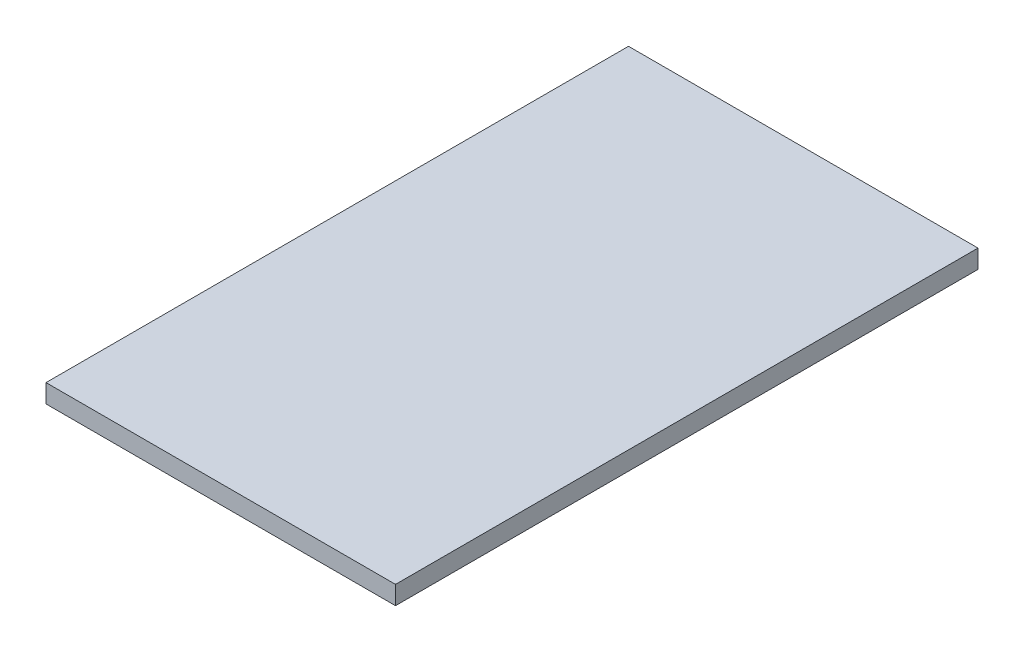
ISO-10303-21;
HEADER;
FILE_DESCRIPTION(('STEP AP214'),'2;1');
FILE_NAME('part.step','',(''),(''),'','','');
FILE_SCHEMA(('AUTOMOTIVE_DESIGN { 1 0 10303 214 1 1 1 1 }'));
ENDSEC;
DATA;
#1=APPLICATION_CONTEXT('core data for automotive mechanical design processes');
#2=APPLICATION_PROTOCOL_DEFINITION('international standard','automotive_design',2000,#1);
#3=PRODUCT_CONTEXT('',#1,'mechanical');
#4=PRODUCT('Part','Part','',(#3));
#5=PRODUCT_RELATED_PRODUCT_CATEGORY('part','',(#4));
#6=PRODUCT_DEFINITION_FORMATION('','',#4);
#7=PRODUCT_DEFINITION_CONTEXT('part definition',#1,'design');
#8=PRODUCT_DEFINITION('design','',#6,#7);
#9=PRODUCT_DEFINITION_SHAPE('','',#8);
#10=(LENGTH_UNIT() NAMED_UNIT(*) SI_UNIT(.MILLI.,.METRE.));
#11=(NAMED_UNIT(*) PLANE_ANGLE_UNIT() SI_UNIT($,.RADIAN.));
#12=(NAMED_UNIT(*) SI_UNIT($,.STERADIAN.) SOLID_ANGLE_UNIT());
#13=UNCERTAINTY_MEASURE_WITH_UNIT(LENGTH_MEASURE(1.E-05),#10,'distance_accuracy_value','');
#14=(GEOMETRIC_REPRESENTATION_CONTEXT(3) GLOBAL_UNCERTAINTY_ASSIGNED_CONTEXT((#13)) GLOBAL_UNIT_ASSIGNED_CONTEXT((#10,
#11,#12)) REPRESENTATION_CONTEXT('',''));
#15=CARTESIAN_POINT('',(0.,0.,0.));
#16=DIRECTION('',(0.,0.,1.));
#17=DIRECTION('',(1.,0.,0.));
#18=AXIS2_PLACEMENT_3D('',#15,#16,#17);
#19=CARTESIAN_POINT('',(15.,0.79375,50.));
#20=DIRECTION('',(-1.,0.,0.));
#21=DIRECTION('',(0.,0.,1.));
#22=AXIS2_PLACEMENT_3D('',#19,#20,#21);
#23=PLANE('',#22);
#24=DIRECTION('',(0.,1.,0.));
#25=VECTOR('',#24,1.);
#26=CARTESIAN_POINT('',(15.,0.79375,0.));
#27=LINE('',#26,#25);
#28=CARTESIAN_POINT('',(15.,-0.79375,0.));
#29=VERTEX_POINT('',#28);
#30=CARTESIAN_POINT('',(15.,0.79375,0.));
#31=VERTEX_POINT('',#30);
#32=EDGE_CURVE('E102',#29,#31,#27,.T.);
#33=ORIENTED_EDGE('',*,*,#32,.T.);
#34=DIRECTION('',(0.,0.,-1.));
#35=VECTOR('',#34,1.);
#36=CARTESIAN_POINT('',(15.,0.79375,50.));
#37=LINE('',#36,#35);
#38=CARTESIAN_POINT('',(15.,0.79375,50.));
#39=VERTEX_POINT('',#38);
#40=EDGE_CURVE('E11',#39,#31,#37,.T.);
#41=ORIENTED_EDGE('',*,*,#40,.F.);
#42=DIRECTION('',(0.,1.,0.));
#43=VECTOR('',#42,1.);
#44=CARTESIAN_POINT('',(15.,0.79375,50.));
#45=LINE('',#44,#43);
#46=CARTESIAN_POINT('',(15.,-0.79375,50.));
#47=VERTEX_POINT('',#46);
#48=EDGE_CURVE('E90',#47,#39,#45,.T.);
#49=ORIENTED_EDGE('',*,*,#48,.F.);
#50=DIRECTION('',(0.,0.,-1.));
#51=VECTOR('',#50,1.);
#52=CARTESIAN_POINT('',(15.,-0.79375,50.));
#53=LINE('',#52,#51);
#54=EDGE_CURVE('E98',#47,#29,#53,.T.);
#55=ORIENTED_EDGE('',*,*,#54,.T.);
#56=EDGE_LOOP('',(#33,#41,#49,#55));
#57=FACE_BOUND('',#56,.T.);
#58=ADVANCED_FACE('F39',(#57),#23,.F.);
#59=CARTESIAN_POINT('',(-15.,0.79375,50.));
#60=DIRECTION('',(0.,-1.,0.));
#61=DIRECTION('',(0.,0.,-1.));
#62=AXIS2_PLACEMENT_3D('',#59,#60,#61);
#63=PLANE('',#62);
#64=DIRECTION('',(-1.,0.,0.));
#65=VECTOR('',#64,1.);
#66=CARTESIAN_POINT('',(-15.,0.79375,0.));
#67=LINE('',#66,#65);
#68=CARTESIAN_POINT('',(-15.,0.79375,0.));
#69=VERTEX_POINT('',#68);
#70=EDGE_CURVE('E94',#31,#69,#67,.T.);
#71=ORIENTED_EDGE('',*,*,#70,.T.);
#72=DIRECTION('',(0.,0.,-1.));
#73=VECTOR('',#72,1.);
#74=CARTESIAN_POINT('',(-15.,0.79375,50.));
#75=LINE('',#74,#73);
#76=CARTESIAN_POINT('',(-15.,0.79375,50.));
#77=VERTEX_POINT('',#76);
#78=EDGE_CURVE('E47',#77,#69,#75,.T.);
#79=ORIENTED_EDGE('',*,*,#78,.F.);
#80=DIRECTION('',(-1.,0.,0.));
#81=VECTOR('',#80,1.);
#82=CARTESIAN_POINT('',(-15.,0.79375,50.));
#83=LINE('',#82,#81);
#84=EDGE_CURVE('E85',#39,#77,#83,.T.);
#85=ORIENTED_EDGE('',*,*,#84,.F.);
#86=ORIENTED_EDGE('',*,*,#40,.T.);
#87=EDGE_LOOP('',(#71,#79,#85,#86));
#88=FACE_BOUND('',#87,.T.);
#89=ADVANCED_FACE('F93',(#88),#63,.F.);
#90=CARTESIAN_POINT('',(-15.,0.79375,50.));
#91=DIRECTION('',(1.,0.,0.));
#92=DIRECTION('',(0.,0.,-1.));
#93=AXIS2_PLACEMENT_3D('',#90,#91,#92);
#94=PLANE('',#93);
#95=DIRECTION('',(0.,-1.,0.));
#96=VECTOR('',#95,1.);
#97=CARTESIAN_POINT('',(-15.,0.79375,0.));
#98=LINE('',#97,#96);
#99=CARTESIAN_POINT('',(-15.,-0.79375,0.));
#100=VERTEX_POINT('',#99);
#101=EDGE_CURVE('E72',#69,#100,#98,.T.);
#102=ORIENTED_EDGE('',*,*,#101,.T.);
#103=DIRECTION('',(0.,0.,-1.));
#104=VECTOR('',#103,1.);
#105=CARTESIAN_POINT('',(-15.,-0.79375,50.));
#106=LINE('',#105,#104);
#107=CARTESIAN_POINT('',(-15.,-0.79375,50.));
#108=VERTEX_POINT('',#107);
#109=EDGE_CURVE('E95',#108,#100,#106,.T.);
#110=ORIENTED_EDGE('',*,*,#109,.F.);
#111=DIRECTION('',(0.,-1.,0.));
#112=VECTOR('',#111,1.);
#113=CARTESIAN_POINT('',(-15.,0.79375,50.));
#114=LINE('',#113,#112);
#115=EDGE_CURVE('E88',#77,#108,#114,.T.);
#116=ORIENTED_EDGE('',*,*,#115,.F.);
#117=ORIENTED_EDGE('',*,*,#78,.T.);
#118=EDGE_LOOP('',(#102,#110,#116,#117));
#119=FACE_BOUND('',#118,.T.);
#120=ADVANCED_FACE('F96',(#119),#94,.F.);
#121=CARTESIAN_POINT('',(-15.,-0.79375,50.));
#122=DIRECTION('',(0.,1.,0.));
#123=DIRECTION('',(0.,0.,1.));
#124=AXIS2_PLACEMENT_3D('',#121,#122,#123);
#125=PLANE('',#124);
#126=DIRECTION('',(1.,0.,0.));
#127=VECTOR('',#126,1.);
#128=CARTESIAN_POINT('',(-15.,-0.79375,0.));
#129=LINE('',#128,#127);
#130=EDGE_CURVE('E78',#100,#29,#129,.T.);
#131=ORIENTED_EDGE('',*,*,#130,.T.);
#132=ORIENTED_EDGE('',*,*,#54,.F.);
#133=DIRECTION('',(1.,0.,0.));
#134=VECTOR('',#133,1.);
#135=CARTESIAN_POINT('',(-15.,-0.79375,50.));
#136=LINE('',#135,#134);
#137=EDGE_CURVE('E55',#108,#47,#136,.T.);
#138=ORIENTED_EDGE('',*,*,#137,.F.);
#139=ORIENTED_EDGE('',*,*,#109,.T.);
#140=EDGE_LOOP('',(#131,#132,#138,#139));
#141=FACE_BOUND('',#140,.T.);
#142=ADVANCED_FACE('F109',(#141),#125,.F.);
#143=CARTESIAN_POINT('',(0.,0.,50.));
#144=DIRECTION('',(0.,0.,1.));
#145=DIRECTION('',(1.,0.,0.));
#146=AXIS2_PLACEMENT_3D('',#143,#144,#145);
#147=PLANE('',#146);
#148=ORIENTED_EDGE('',*,*,#48,.T.);
#149=ORIENTED_EDGE('',*,*,#84,.T.);
#150=ORIENTED_EDGE('',*,*,#115,.T.);
#151=ORIENTED_EDGE('',*,*,#137,.T.);
#152=EDGE_LOOP('',(#148,#149,#150,#151));
#153=FACE_BOUND('',#152,.T.);
#154=ADVANCED_FACE('F86',(#153),#147,.T.);
#155=CARTESIAN_POINT('',(0.,0.,0.));
#156=DIRECTION('',(0.,0.,1.));
#157=DIRECTION('',(1.,0.,0.));
#158=AXIS2_PLACEMENT_3D('',#155,#156,#157);
#159=PLANE('',#158);
#160=ORIENTED_EDGE('',*,*,#32,.F.);
#161=ORIENTED_EDGE('',*,*,#130,.F.);
#162=ORIENTED_EDGE('',*,*,#101,.F.);
#163=ORIENTED_EDGE('',*,*,#70,.F.);
#164=EDGE_LOOP('',(#160,#161,#162,#163));
#165=FACE_BOUND('',#164,.T.);
#166=ADVANCED_FACE('F112',(#165),#159,.F.);
#167=CLOSED_SHELL('',(#58,#89,#120,#142,#154,#166));
#168=MANIFOLD_SOLID_BREP('B2',#167);
#169=ADVANCED_BREP_SHAPE_REPRESENTATION('',(#18,#168),#14);
#170=SHAPE_DEFINITION_REPRESENTATION(#9,#169);
ENDSEC;
END-ISO-10303-21;
